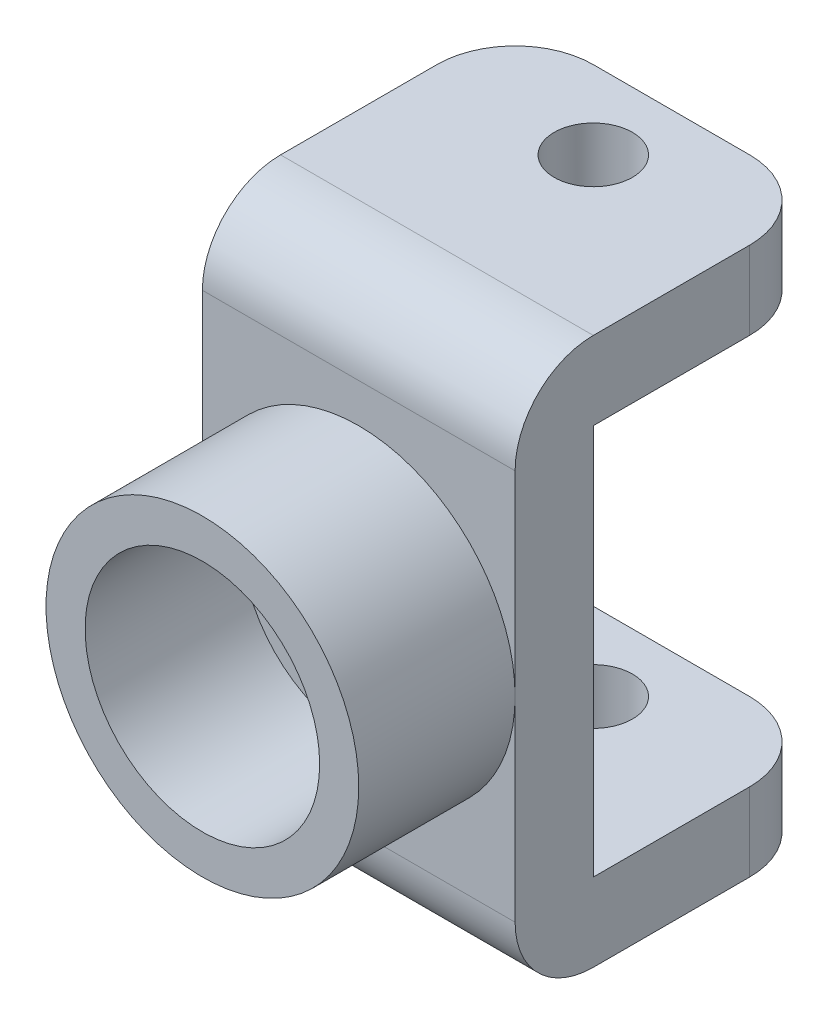
ISO-10303-21;
HEADER;
FILE_DESCRIPTION(('STEP AP214'),'2;1');
FILE_NAME('part.step','',(''),(''),'','','');
FILE_SCHEMA(('AUTOMOTIVE_DESIGN { 1 0 10303 214 1 1 1 1 }'));
ENDSEC;
DATA;
#1=APPLICATION_CONTEXT('core data for automotive mechanical design processes');
#2=APPLICATION_PROTOCOL_DEFINITION('international standard','automotive_design',2000,#1);
#3=PRODUCT_CONTEXT('',#1,'mechanical');
#4=PRODUCT('Part','Part','',(#3));
#5=PRODUCT_RELATED_PRODUCT_CATEGORY('part','',(#4));
#6=PRODUCT_DEFINITION_FORMATION('','',#4);
#7=PRODUCT_DEFINITION_CONTEXT('part definition',#1,'design');
#8=PRODUCT_DEFINITION('design','',#6,#7);
#9=PRODUCT_DEFINITION_SHAPE('','',#8);
#10=(LENGTH_UNIT() NAMED_UNIT(*) SI_UNIT(.MILLI.,.METRE.));
#11=(NAMED_UNIT(*) PLANE_ANGLE_UNIT() SI_UNIT($,.RADIAN.));
#12=(NAMED_UNIT(*) SI_UNIT($,.STERADIAN.) SOLID_ANGLE_UNIT());
#13=UNCERTAINTY_MEASURE_WITH_UNIT(LENGTH_MEASURE(1.E-05),#10,'distance_accuracy_value','');
#14=(GEOMETRIC_REPRESENTATION_CONTEXT(3) GLOBAL_UNCERTAINTY_ASSIGNED_CONTEXT((#13)) GLOBAL_UNIT_ASSIGNED_CONTEXT((#10,
#11,#12)) REPRESENTATION_CONTEXT('',''));
#15=CARTESIAN_POINT('',(0.,0.,0.));
#16=DIRECTION('',(0.,0.,1.));
#17=DIRECTION('',(1.,0.,0.));
#18=AXIS2_PLACEMENT_3D('',#15,#16,#17);
#19=CARTESIAN_POINT('',(0.,0.,10.));
#20=DIRECTION('',(0.,0.,1.));
#21=DIRECTION('',(1.,0.,0.));
#22=AXIS2_PLACEMENT_3D('',#19,#20,#21);
#23=PLANE('',#22);
#24=DIRECTION('',(0.,1.,0.));
#25=VECTOR('',#24,1.);
#26=CARTESIAN_POINT('',(20.,25.,10.));
#27=LINE('',#26,#25);
#28=CARTESIAN_POINT('',(20.,-25.,10.));
#29=VERTEX_POINT('',#28);
#30=CARTESIAN_POINT('',(20.,0.,10.));
#31=VERTEX_POINT('',#30);
#32=EDGE_CURVE('E159',#29,#31,#27,.T.);
#33=ORIENTED_EDGE('',*,*,#32,.T.);
#34=CARTESIAN_POINT('',(0.,0.,10.));
#35=DIRECTION('',(0.,0.,1.));
#36=DIRECTION('',(1.,0.,0.));
#37=AXIS2_PLACEMENT_3D('',#34,#35,#36);
#38=CIRCLE('',#37,20.);
#39=CARTESIAN_POINT('',(-20.,0.,10.));
#40=VERTEX_POINT('',#39);
#41=EDGE_CURVE('E11',#31,#40,#38,.F.);
#42=ORIENTED_EDGE('',*,*,#41,.T.);
#43=DIRECTION('',(0.,-1.,0.));
#44=VECTOR('',#43,1.);
#45=CARTESIAN_POINT('',(-20.,25.,10.));
#46=LINE('',#45,#44);
#47=CARTESIAN_POINT('',(-20.,-25.,10.));
#48=VERTEX_POINT('',#47);
#49=EDGE_CURVE('E156',#40,#48,#46,.T.);
#50=ORIENTED_EDGE('',*,*,#49,.T.);
#51=DIRECTION('',(-1.,0.,0.));
#52=VECTOR('',#51,1.);
#53=CARTESIAN_POINT('',(20.,-25.,10.));
#54=LINE('',#53,#52);
#55=EDGE_CURVE('E218',#48,#29,#54,.F.);
#56=ORIENTED_EDGE('',*,*,#55,.T.);
#57=EDGE_LOOP('',(#33,#42,#50,#56));
#58=FACE_BOUND('',#57,.T.);
#59=ADVANCED_FACE('F39',(#58),#23,.T.);
#60=CARTESIAN_POINT('',(20.,25.,10.));
#61=DIRECTION('',(-1.,0.,0.));
#62=DIRECTION('',(0.,-1.,0.));
#63=AXIS2_PLACEMENT_3D('',#60,#61,#62);
#64=PLANE('',#63);
#65=ORIENTED_EDGE('',*,*,#32,.F.);
#66=CARTESIAN_POINT('',(20.,-25.,0.));
#67=DIRECTION('',(-1.,0.,0.));
#68=DIRECTION('',(0.,-1.,0.));
#69=AXIS2_PLACEMENT_3D('',#66,#67,#68);
#70=CIRCLE('',#69,10.);
#71=CARTESIAN_POINT('',(20.,-35.,0.));
#72=VERTEX_POINT('',#71);
#73=EDGE_CURVE('E233',#29,#72,#70,.F.);
#74=ORIENTED_EDGE('',*,*,#73,.T.);
#75=DIRECTION('',(0.,0.,-1.));
#76=VECTOR('',#75,1.);
#77=CARTESIAN_POINT('',(20.,-35.,10.));
#78=LINE('',#77,#76);
#79=CARTESIAN_POINT('',(20.,-35.,-20.));
#80=VERTEX_POINT('',#79);
#81=EDGE_CURVE('E377',#72,#80,#78,.T.);
#82=ORIENTED_EDGE('',*,*,#81,.T.);
#83=DIRECTION('',(0.,1.,0.));
#84=VECTOR('',#83,1.);
#85=CARTESIAN_POINT('',(20.,25.,-20.));
#86=LINE('',#85,#84);
#87=CARTESIAN_POINT('',(20.,-25.,-20.));
#88=VERTEX_POINT('',#87);
#89=EDGE_CURVE('E229',#80,#88,#86,.T.);
#90=ORIENTED_EDGE('',*,*,#89,.T.);
#91=DIRECTION('',(0.,0.,1.));
#92=VECTOR('',#91,1.);
#93=CARTESIAN_POINT('',(20.,-25.,10.));
#94=LINE('',#93,#92);
#95=CARTESIAN_POINT('',(20.,-25.,0.));
#96=VERTEX_POINT('',#95);
#97=EDGE_CURVE('E371',#88,#96,#94,.T.);
#98=ORIENTED_EDGE('',*,*,#97,.T.);
#99=DIRECTION('',(0.,1.,0.));
#100=VECTOR('',#99,1.);
#101=CARTESIAN_POINT('',(20.,25.,0.));
#102=LINE('',#101,#100);
#103=CARTESIAN_POINT('',(20.,25.,0.));
#104=VERTEX_POINT('',#103);
#105=EDGE_CURVE('E181',#96,#104,#102,.T.);
#106=ORIENTED_EDGE('',*,*,#105,.T.);
#107=DIRECTION('',(0.,0.,-1.));
#108=VECTOR('',#107,1.);
#109=CARTESIAN_POINT('',(20.,25.,10.));
#110=LINE('',#109,#108);
#111=CARTESIAN_POINT('',(20.,25.,-20.));
#112=VERTEX_POINT('',#111);
#113=EDGE_CURVE('E338',#104,#112,#110,.T.);
#114=ORIENTED_EDGE('',*,*,#113,.T.);
#115=DIRECTION('',(0.,1.,0.));
#116=VECTOR('',#115,1.);
#117=CARTESIAN_POINT('',(20.,25.,-20.));
#118=LINE('',#117,#116);
#119=CARTESIAN_POINT('',(20.,35.,-20.));
#120=VERTEX_POINT('',#119);
#121=EDGE_CURVE('E221',#112,#120,#118,.T.);
#122=ORIENTED_EDGE('',*,*,#121,.T.);
#123=DIRECTION('',(0.,0.,1.));
#124=VECTOR('',#123,1.);
#125=CARTESIAN_POINT('',(20.,35.,10.));
#126=LINE('',#125,#124);
#127=CARTESIAN_POINT('',(20.,35.,0.));
#128=VERTEX_POINT('',#127);
#129=EDGE_CURVE('E332',#120,#128,#126,.T.);
#130=ORIENTED_EDGE('',*,*,#129,.T.);
#131=CARTESIAN_POINT('',(20.,25.,0.));
#132=DIRECTION('',(-1.,0.,0.));
#133=DIRECTION('',(0.,-1.,0.));
#134=AXIS2_PLACEMENT_3D('',#131,#132,#133);
#135=CIRCLE('',#134,10.);
#136=CARTESIAN_POINT('',(20.,25.,10.));
#137=VERTEX_POINT('',#136);
#138=EDGE_CURVE('E225',#128,#137,#135,.F.);
#139=ORIENTED_EDGE('',*,*,#138,.T.);
#140=EDGE_CURVE('E197',#31,#137,#27,.T.);
#141=ORIENTED_EDGE('',*,*,#140,.F.);
#142=EDGE_LOOP('',(#65,#74,#82,#90,#98,#106,#114,#122,#130,#139,#141));
#143=FACE_BOUND('',#142,.T.);
#144=ADVANCED_FACE('F293',(#143),#64,.F.);
#145=CARTESIAN_POINT('',(-20.,25.,10.));
#146=DIRECTION('',(1.,0.,0.));
#147=DIRECTION('',(0.,1.,0.));
#148=AXIS2_PLACEMENT_3D('',#145,#146,#147);
#149=PLANE('',#148);
#150=DIRECTION('',(0.,0.,-1.));
#151=VECTOR('',#150,1.);
#152=CARTESIAN_POINT('',(-20.,-35.,10.));
#153=LINE('',#152,#151);
#154=CARTESIAN_POINT('',(-20.,-35.,0.));
#155=VERTEX_POINT('',#154);
#156=CARTESIAN_POINT('',(-20.,-35.,-20.));
#157=VERTEX_POINT('',#156);
#158=EDGE_CURVE('E386',#155,#157,#153,.T.);
#159=ORIENTED_EDGE('',*,*,#158,.F.);
#160=CARTESIAN_POINT('',(-20.,-25.,0.));
#161=DIRECTION('',(1.,0.,0.));
#162=DIRECTION('',(0.,1.,0.));
#163=AXIS2_PLACEMENT_3D('',#160,#161,#162);
#164=CIRCLE('',#163,10.);
#165=EDGE_CURVE('E165',#155,#48,#164,.F.);
#166=ORIENTED_EDGE('',*,*,#165,.T.);
#167=ORIENTED_EDGE('',*,*,#49,.F.);
#168=CARTESIAN_POINT('',(-20.,25.,10.));
#169=VERTEX_POINT('',#168);
#170=EDGE_CURVE('E164',#169,#40,#46,.T.);
#171=ORIENTED_EDGE('',*,*,#170,.F.);
#172=CARTESIAN_POINT('',(-20.,25.,0.));
#173=DIRECTION('',(1.,0.,0.));
#174=DIRECTION('',(0.,1.,0.));
#175=AXIS2_PLACEMENT_3D('',#172,#173,#174);
#176=CIRCLE('',#175,10.);
#177=CARTESIAN_POINT('',(-20.,35.,0.));
#178=VERTEX_POINT('',#177);
#179=EDGE_CURVE('E205',#169,#178,#176,.F.);
#180=ORIENTED_EDGE('',*,*,#179,.T.);
#181=DIRECTION('',(0.,0.,1.));
#182=VECTOR('',#181,1.);
#183=CARTESIAN_POINT('',(-20.,35.,10.));
#184=LINE('',#183,#182);
#185=CARTESIAN_POINT('',(-20.,35.,-20.));
#186=VERTEX_POINT('',#185);
#187=EDGE_CURVE('E344',#186,#178,#184,.T.);
#188=ORIENTED_EDGE('',*,*,#187,.F.);
#189=DIRECTION('',(0.,1.,0.));
#190=VECTOR('',#189,1.);
#191=CARTESIAN_POINT('',(-20.,25.,-20.));
#192=LINE('',#191,#190);
#193=CARTESIAN_POINT('',(-20.,25.,-20.));
#194=VERTEX_POINT('',#193);
#195=EDGE_CURVE('E208',#186,#194,#192,.F.);
#196=ORIENTED_EDGE('',*,*,#195,.T.);
#197=DIRECTION('',(0.,0.,-1.));
#198=VECTOR('',#197,1.);
#199=CARTESIAN_POINT('',(-20.,25.,10.));
#200=LINE('',#199,#198);
#201=CARTESIAN_POINT('',(-20.,25.,0.));
#202=VERTEX_POINT('',#201);
#203=EDGE_CURVE('E348',#202,#194,#200,.T.);
#204=ORIENTED_EDGE('',*,*,#203,.F.);
#205=DIRECTION('',(0.,-1.,0.));
#206=VECTOR('',#205,1.);
#207=CARTESIAN_POINT('',(-20.,25.,0.));
#208=LINE('',#207,#206);
#209=CARTESIAN_POINT('',(-20.,-25.,0.));
#210=VERTEX_POINT('',#209);
#211=EDGE_CURVE('E190',#202,#210,#208,.T.);
#212=ORIENTED_EDGE('',*,*,#211,.T.);
#213=DIRECTION('',(0.,0.,1.));
#214=VECTOR('',#213,1.);
#215=CARTESIAN_POINT('',(-20.,-25.,10.));
#216=LINE('',#215,#214);
#217=CARTESIAN_POINT('',(-20.,-25.,-20.));
#218=VERTEX_POINT('',#217);
#219=EDGE_CURVE('E383',#218,#210,#216,.T.);
#220=ORIENTED_EDGE('',*,*,#219,.F.);
#221=DIRECTION('',(0.,1.,0.));
#222=VECTOR('',#221,1.);
#223=CARTESIAN_POINT('',(-20.,25.,-20.));
#224=LINE('',#223,#222);
#225=EDGE_CURVE('E211',#218,#157,#224,.F.);
#226=ORIENTED_EDGE('',*,*,#225,.T.);
#227=EDGE_LOOP('',(#159,#166,#167,#171,#180,#188,#196,#204,#212,#220,#226));
#228=FACE_BOUND('',#227,.T.);
#229=ADVANCED_FACE('F163',(#228),#149,.F.);
#230=ORIENTED_EDGE('',*,*,#170,.T.);
#231=CARTESIAN_POINT('',(0.,0.,10.));
#232=DIRECTION('',(0.,0.,1.));
#233=DIRECTION('',(1.,0.,0.));
#234=AXIS2_PLACEMENT_3D('',#231,#232,#233);
#235=CIRCLE('',#234,20.);
#236=EDGE_CURVE('E144',#31,#40,#235,.T.);
#237=ORIENTED_EDGE('',*,*,#236,.F.);
#238=ORIENTED_EDGE('',*,*,#140,.T.);
#239=DIRECTION('',(-1.,0.,0.));
#240=VECTOR('',#239,1.);
#241=CARTESIAN_POINT('',(-20.,25.,10.));
#242=LINE('',#241,#240);
#243=EDGE_CURVE('E172',#137,#169,#242,.T.);
#244=ORIENTED_EDGE('',*,*,#243,.T.);
#245=EDGE_LOOP('',(#230,#237,#238,#244));
#246=FACE_BOUND('',#245,.T.);
#247=ADVANCED_FACE('F170',(#246),#23,.T.);
#248=CARTESIAN_POINT('',(0.,0.,0.));
#249=DIRECTION('',(0.,0.,1.));
#250=DIRECTION('',(1.,0.,0.));
#251=AXIS2_PLACEMENT_3D('',#248,#249,#250);
#252=PLANE('',#251);
#253=ORIENTED_EDGE('',*,*,#105,.F.);
#254=DIRECTION('',(1.,0.,0.));
#255=VECTOR('',#254,1.);
#256=CARTESIAN_POINT('',(-20.,-25.,0.));
#257=LINE('',#256,#255);
#258=EDGE_CURVE('E194',#210,#96,#257,.T.);
#259=ORIENTED_EDGE('',*,*,#258,.F.);
#260=ORIENTED_EDGE('',*,*,#211,.F.);
#261=DIRECTION('',(-1.,0.,0.));
#262=VECTOR('',#261,1.);
#263=CARTESIAN_POINT('',(-20.,25.,0.));
#264=LINE('',#263,#262);
#265=EDGE_CURVE('E185',#104,#202,#264,.T.);
#266=ORIENTED_EDGE('',*,*,#265,.F.);
#267=EDGE_LOOP('',(#253,#259,#260,#266));
#268=FACE_BOUND('',#267,.T.);
#269=ADVANCED_FACE('F291',(#268),#252,.F.);
#270=CARTESIAN_POINT('',(20.,25.,10.));
#271=DIRECTION('',(0.,1.,0.));
#272=DIRECTION('',(0.,0.,1.));
#273=AXIS2_PLACEMENT_3D('',#270,#271,#272);
#274=PLANE('',#273);
#275=CARTESIAN_POINT('',(0.,25.,-20.));
#276=DIRECTION('',(0.,1.,0.));
#277=DIRECTION('',(0.,0.,1.));
#278=AXIS2_PLACEMENT_3D('',#275,#276,#277);
#279=CIRCLE('',#278,5.);
#280=CARTESIAN_POINT('',(0.,25.,-15.));
#281=VERTEX_POINT('',#280);
#282=EDGE_CURVE('E433',#281,#281,#279,.T.);
#283=ORIENTED_EDGE('',*,*,#282,.T.);
#284=EDGE_LOOP('',(#283));
#285=FACE_BOUND('',#284,.T.);
#286=ORIENTED_EDGE('',*,*,#203,.T.);
#287=CARTESIAN_POINT('',(-10.,25.,-20.));
#288=DIRECTION('',(0.,1.,0.));
#289=DIRECTION('',(0.,0.,1.));
#290=AXIS2_PLACEMENT_3D('',#287,#288,#289);
#291=CIRCLE('',#290,10.);
#292=CARTESIAN_POINT('',(-10.,25.,-30.));
#293=VERTEX_POINT('',#292);
#294=EDGE_CURVE('E60',#194,#293,#291,.F.);
#295=ORIENTED_EDGE('',*,*,#294,.T.);
#296=DIRECTION('',(-1.,0.,0.));
#297=VECTOR('',#296,1.);
#298=CARTESIAN_POINT('',(20.,25.,-30.));
#299=LINE('',#298,#297);
#300=CARTESIAN_POINT('',(9.99999999999999,25.,-30.));
#301=VERTEX_POINT('',#300);
#302=EDGE_CURVE('E186',#301,#293,#299,.T.);
#303=ORIENTED_EDGE('',*,*,#302,.F.);
#304=CARTESIAN_POINT('',(9.99999999999999,25.,-20.));
#305=DIRECTION('',(0.,1.,0.));
#306=DIRECTION('',(0.,0.,1.));
#307=AXIS2_PLACEMENT_3D('',#304,#305,#306);
#308=CIRCLE('',#307,10.);
#309=EDGE_CURVE('E265',#301,#112,#308,.F.);
#310=ORIENTED_EDGE('',*,*,#309,.T.);
#311=ORIENTED_EDGE('',*,*,#113,.F.);
#312=ORIENTED_EDGE('',*,*,#265,.T.);
#313=EDGE_LOOP('',(#286,#295,#303,#310,#311,#312));
#314=FACE_BOUND('',#313,.T.);
#315=ADVANCED_FACE('F365',(#285,#314),#274,.F.);
#316=CARTESIAN_POINT('',(20.,25.,-30.));
#317=DIRECTION('',(0.,0.,1.));
#318=DIRECTION('',(1.,0.,0.));
#319=AXIS2_PLACEMENT_3D('',#316,#317,#318);
#320=PLANE('',#319);
#321=ORIENTED_EDGE('',*,*,#302,.T.);
#322=DIRECTION('',(0.,1.,0.));
#323=VECTOR('',#322,1.);
#324=CARTESIAN_POINT('',(-10.,25.,-30.));
#325=LINE('',#324,#323);
#326=CARTESIAN_POINT('',(-10.,35.,-30.));
#327=VERTEX_POINT('',#326);
#328=EDGE_CURVE('E252',#293,#327,#325,.T.);
#329=ORIENTED_EDGE('',*,*,#328,.T.);
#330=DIRECTION('',(-1.,0.,0.));
#331=VECTOR('',#330,1.);
#332=CARTESIAN_POINT('',(20.,35.,-30.));
#333=LINE('',#332,#331);
#334=CARTESIAN_POINT('',(9.99999999999999,35.,-30.));
#335=VERTEX_POINT('',#334);
#336=EDGE_CURVE('E337',#335,#327,#333,.T.);
#337=ORIENTED_EDGE('',*,*,#336,.F.);
#338=DIRECTION('',(0.,1.,0.));
#339=VECTOR('',#338,1.);
#340=CARTESIAN_POINT('',(9.99999999999999,25.,-30.));
#341=LINE('',#340,#339);
#342=EDGE_CURVE('E249',#335,#301,#341,.F.);
#343=ORIENTED_EDGE('',*,*,#342,.T.);
#344=EDGE_LOOP('',(#321,#329,#337,#343));
#345=FACE_BOUND('',#344,.T.);
#346=ADVANCED_FACE('F357',(#345),#320,.F.);
#347=CARTESIAN_POINT('',(20.,35.,10.));
#348=DIRECTION('',(0.,-1.,0.));
#349=DIRECTION('',(0.,0.,-1.));
#350=AXIS2_PLACEMENT_3D('',#347,#348,#349);
#351=PLANE('',#350);
#352=CARTESIAN_POINT('',(0.,35.,-20.));
#353=DIRECTION('',(0.,-1.,0.));
#354=DIRECTION('',(0.,0.,-1.));
#355=AXIS2_PLACEMENT_3D('',#352,#353,#354);
#356=CIRCLE('',#355,5.);
#357=CARTESIAN_POINT('',(0.,35.,-25.));
#358=VERTEX_POINT('',#357);
#359=EDGE_CURVE('E443',#358,#358,#356,.T.);
#360=ORIENTED_EDGE('',*,*,#359,.T.);
#361=EDGE_LOOP('',(#360));
#362=FACE_BOUND('',#361,.T.);
#363=ORIENTED_EDGE('',*,*,#336,.T.);
#364=CARTESIAN_POINT('',(-10.,35.,-20.));
#365=DIRECTION('',(0.,-1.,0.));
#366=DIRECTION('',(0.,0.,-1.));
#367=AXIS2_PLACEMENT_3D('',#364,#365,#366);
#368=CIRCLE('',#367,10.);
#369=EDGE_CURVE('E262',#327,#186,#368,.F.);
#370=ORIENTED_EDGE('',*,*,#369,.T.);
#371=ORIENTED_EDGE('',*,*,#187,.T.);
#372=DIRECTION('',(-1.,0.,0.));
#373=VECTOR('',#372,1.);
#374=CARTESIAN_POINT('',(20.,35.,0.));
#375=LINE('',#374,#373);
#376=EDGE_CURVE('E259',#178,#128,#375,.F.);
#377=ORIENTED_EDGE('',*,*,#376,.T.);
#378=ORIENTED_EDGE('',*,*,#129,.F.);
#379=CARTESIAN_POINT('',(9.99999999999999,35.,-20.));
#380=DIRECTION('',(0.,-1.,0.));
#381=DIRECTION('',(0.,0.,-1.));
#382=AXIS2_PLACEMENT_3D('',#379,#380,#381);
#383=CIRCLE('',#382,10.);
#384=EDGE_CURVE('E256',#120,#335,#383,.F.);
#385=ORIENTED_EDGE('',*,*,#384,.T.);
#386=EDGE_LOOP('',(#363,#370,#371,#377,#378,#385));
#387=FACE_BOUND('',#386,.T.);
#388=ADVANCED_FACE('F363',(#362,#387),#351,.F.);
#389=CARTESIAN_POINT('',(20.,-25.,10.));
#390=DIRECTION('',(0.,-1.,0.));
#391=DIRECTION('',(0.,0.,-1.));
#392=AXIS2_PLACEMENT_3D('',#389,#390,#391);
#393=PLANE('',#392);
#394=CARTESIAN_POINT('',(0.,-25.,-20.));
#395=DIRECTION('',(0.,-1.,0.));
#396=DIRECTION('',(0.,0.,-1.));
#397=AXIS2_PLACEMENT_3D('',#394,#395,#396);
#398=CIRCLE('',#397,5.);
#399=CARTESIAN_POINT('',(0.,-25.,-25.));
#400=VERTEX_POINT('',#399);
#401=EDGE_CURVE('E436',#400,#400,#398,.T.);
#402=ORIENTED_EDGE('',*,*,#401,.T.);
#403=EDGE_LOOP('',(#402));
#404=FACE_BOUND('',#403,.T.);
#405=ORIENTED_EDGE('',*,*,#97,.F.);
#406=CARTESIAN_POINT('',(10.,-25.,-20.));
#407=DIRECTION('',(0.,-1.,0.));
#408=DIRECTION('',(0.,0.,-1.));
#409=AXIS2_PLACEMENT_3D('',#406,#407,#408);
#410=CIRCLE('',#409,10.);
#411=CARTESIAN_POINT('',(10.,-25.,-30.));
#412=VERTEX_POINT('',#411);
#413=EDGE_CURVE('E239',#88,#412,#410,.F.);
#414=ORIENTED_EDGE('',*,*,#413,.T.);
#415=DIRECTION('',(-1.,0.,0.));
#416=VECTOR('',#415,1.);
#417=CARTESIAN_POINT('',(20.,-25.,-30.));
#418=LINE('',#417,#416);
#419=CARTESIAN_POINT('',(-10.,-25.,-30.));
#420=VERTEX_POINT('',#419);
#421=EDGE_CURVE('E376',#412,#420,#418,.T.);
#422=ORIENTED_EDGE('',*,*,#421,.T.);
#423=CARTESIAN_POINT('',(-10.,-25.,-20.));
#424=DIRECTION('',(0.,-1.,0.));
#425=DIRECTION('',(0.,0.,-1.));
#426=AXIS2_PLACEMENT_3D('',#423,#424,#425);
#427=CIRCLE('',#426,10.);
#428=EDGE_CURVE('E236',#420,#218,#427,.F.);
#429=ORIENTED_EDGE('',*,*,#428,.T.);
#430=ORIENTED_EDGE('',*,*,#219,.T.);
#431=ORIENTED_EDGE('',*,*,#258,.T.);
#432=EDGE_LOOP('',(#405,#414,#422,#429,#430,#431));
#433=FACE_BOUND('',#432,.T.);
#434=ADVANCED_FACE('F403',(#404,#433),#393,.F.);
#435=CARTESIAN_POINT('',(20.,-35.,10.));
#436=DIRECTION('',(0.,1.,0.));
#437=DIRECTION('',(0.,0.,1.));
#438=AXIS2_PLACEMENT_3D('',#435,#436,#437);
#439=PLANE('',#438);
#440=CARTESIAN_POINT('',(0.,-35.,-20.));
#441=DIRECTION('',(0.,-1.,0.));
#442=DIRECTION('',(0.,0.,-1.));
#443=AXIS2_PLACEMENT_3D('',#440,#441,#442);
#444=CIRCLE('',#443,5.);
#445=CARTESIAN_POINT('',(0.,-35.,-25.));
#446=VERTEX_POINT('',#445);
#447=EDGE_CURVE('E466',#446,#446,#444,.T.);
#448=ORIENTED_EDGE('',*,*,#447,.F.);
#449=EDGE_LOOP('',(#448));
#450=FACE_BOUND('',#449,.T.);
#451=ORIENTED_EDGE('',*,*,#81,.F.);
#452=DIRECTION('',(-1.,0.,0.));
#453=VECTOR('',#452,1.);
#454=CARTESIAN_POINT('',(-20.,-35.,0.));
#455=LINE('',#454,#453);
#456=EDGE_CURVE('E201',#72,#155,#455,.T.);
#457=ORIENTED_EDGE('',*,*,#456,.T.);
#458=ORIENTED_EDGE('',*,*,#158,.T.);
#459=CARTESIAN_POINT('',(-10.,-35.,-20.));
#460=DIRECTION('',(0.,1.,0.));
#461=DIRECTION('',(0.,0.,1.));
#462=AXIS2_PLACEMENT_3D('',#459,#460,#461);
#463=CIRCLE('',#462,10.);
#464=CARTESIAN_POINT('',(-10.,-35.,-30.));
#465=VERTEX_POINT('',#464);
#466=EDGE_CURVE('E174',#157,#465,#463,.F.);
#467=ORIENTED_EDGE('',*,*,#466,.T.);
#468=DIRECTION('',(-1.,0.,0.));
#469=VECTOR('',#468,1.);
#470=CARTESIAN_POINT('',(20.,-35.,-30.));
#471=LINE('',#470,#469);
#472=CARTESIAN_POINT('',(10.,-35.,-30.));
#473=VERTEX_POINT('',#472);
#474=EDGE_CURVE('E351',#473,#465,#471,.T.);
#475=ORIENTED_EDGE('',*,*,#474,.F.);
#476=CARTESIAN_POINT('',(10.,-35.,-20.));
#477=DIRECTION('',(0.,1.,0.));
#478=DIRECTION('',(0.,0.,1.));
#479=AXIS2_PLACEMENT_3D('',#476,#477,#478);
#480=CIRCLE('',#479,10.);
#481=EDGE_CURVE('E176',#473,#80,#480,.F.);
#482=ORIENTED_EDGE('',*,*,#481,.T.);
#483=EDGE_LOOP('',(#451,#457,#458,#467,#475,#482));
#484=FACE_BOUND('',#483,.T.);
#485=ADVANCED_FACE('F405',(#450,#484),#439,.F.);
#486=CARTESIAN_POINT('',(20.,-25.,-30.));
#487=DIRECTION('',(0.,0.,1.));
#488=DIRECTION('',(1.,0.,0.));
#489=AXIS2_PLACEMENT_3D('',#486,#487,#488);
#490=PLANE('',#489);
#491=ORIENTED_EDGE('',*,*,#421,.F.);
#492=DIRECTION('',(0.,1.,0.));
#493=VECTOR('',#492,1.);
#494=CARTESIAN_POINT('',(10.,-25.,-30.));
#495=LINE('',#494,#493);
#496=EDGE_CURVE('E246',#412,#473,#495,.F.);
#497=ORIENTED_EDGE('',*,*,#496,.T.);
#498=ORIENTED_EDGE('',*,*,#474,.T.);
#499=DIRECTION('',(0.,1.,0.));
#500=VECTOR('',#499,1.);
#501=CARTESIAN_POINT('',(-10.,-25.,-30.));
#502=LINE('',#501,#500);
#503=EDGE_CURVE('E242',#465,#420,#502,.T.);
#504=ORIENTED_EDGE('',*,*,#503,.T.);
#505=EDGE_LOOP('',(#491,#497,#498,#504));
#506=FACE_BOUND('',#505,.T.);
#507=ADVANCED_FACE('F308',(#506),#490,.F.);
#508=CARTESIAN_POINT('',(20.,-25.,0.));
#509=DIRECTION('',(1.,0.,0.));
#510=DIRECTION('',(0.,0.,-1.));
#511=AXIS2_PLACEMENT_3D('',#508,#509,#510);
#512=CYLINDRICAL_SURFACE('',#511,10.);
#513=ORIENTED_EDGE('',*,*,#73,.F.);
#514=ORIENTED_EDGE('',*,*,#55,.F.);
#515=ORIENTED_EDGE('',*,*,#165,.F.);
#516=ORIENTED_EDGE('',*,*,#456,.F.);
#517=EDGE_LOOP('',(#513,#514,#515,#516));
#518=FACE_BOUND('',#517,.T.);
#519=ADVANCED_FACE('F304',(#518),#512,.T.);
#520=CARTESIAN_POINT('',(9.99999999999999,25.,-20.));
#521=DIRECTION('',(0.,1.,0.));
#522=DIRECTION('',(-1.,0.,0.));
#523=AXIS2_PLACEMENT_3D('',#520,#521,#522);
#524=CYLINDRICAL_SURFACE('',#523,10.);
#525=ORIENTED_EDGE('',*,*,#481,.F.);
#526=ORIENTED_EDGE('',*,*,#496,.F.);
#527=ORIENTED_EDGE('',*,*,#413,.F.);
#528=ORIENTED_EDGE('',*,*,#89,.F.);
#529=EDGE_LOOP('',(#525,#526,#527,#528));
#530=FACE_BOUND('',#529,.T.);
#531=ADVANCED_FACE('F307',(#530),#524,.T.);
#532=CARTESIAN_POINT('',(-10.,-25.,-20.));
#533=DIRECTION('',(0.,1.,0.));
#534=DIRECTION('',(-1.,0.,0.));
#535=AXIS2_PLACEMENT_3D('',#532,#533,#534);
#536=CYLINDRICAL_SURFACE('',#535,10.);
#537=ORIENTED_EDGE('',*,*,#466,.F.);
#538=ORIENTED_EDGE('',*,*,#225,.F.);
#539=ORIENTED_EDGE('',*,*,#428,.F.);
#540=ORIENTED_EDGE('',*,*,#503,.F.);
#541=EDGE_LOOP('',(#537,#538,#539,#540));
#542=FACE_BOUND('',#541,.T.);
#543=ADVANCED_FACE('F312',(#542),#536,.T.);
#544=CARTESIAN_POINT('',(-10.,25.,-20.));
#545=DIRECTION('',(0.,1.,0.));
#546=DIRECTION('',(-1.,0.,0.));
#547=AXIS2_PLACEMENT_3D('',#544,#545,#546);
#548=CYLINDRICAL_SURFACE('',#547,10.);
#549=ORIENTED_EDGE('',*,*,#294,.F.);
#550=ORIENTED_EDGE('',*,*,#195,.F.);
#551=ORIENTED_EDGE('',*,*,#369,.F.);
#552=ORIENTED_EDGE('',*,*,#328,.F.);
#553=EDGE_LOOP('',(#549,#550,#551,#552));
#554=FACE_BOUND('',#553,.T.);
#555=ADVANCED_FACE('F316',(#554),#548,.T.);
#556=CARTESIAN_POINT('',(0.,25.,0.));
#557=DIRECTION('',(1.,0.,0.));
#558=DIRECTION('',(0.,0.,-1.));
#559=AXIS2_PLACEMENT_3D('',#556,#557,#558);
#560=CYLINDRICAL_SURFACE('',#559,10.);
#561=ORIENTED_EDGE('',*,*,#138,.F.);
#562=ORIENTED_EDGE('',*,*,#376,.F.);
#563=ORIENTED_EDGE('',*,*,#179,.F.);
#564=ORIENTED_EDGE('',*,*,#243,.F.);
#565=EDGE_LOOP('',(#561,#562,#563,#564));
#566=FACE_BOUND('',#565,.T.);
#567=ADVANCED_FACE('F319',(#566),#560,.T.);
#568=CARTESIAN_POINT('',(9.99999999999999,25.,-20.));
#569=DIRECTION('',(0.,1.,0.));
#570=DIRECTION('',(-1.,0.,0.));
#571=AXIS2_PLACEMENT_3D('',#568,#569,#570);
#572=CYLINDRICAL_SURFACE('',#571,10.);
#573=ORIENTED_EDGE('',*,*,#309,.F.);
#574=ORIENTED_EDGE('',*,*,#342,.F.);
#575=ORIENTED_EDGE('',*,*,#384,.F.);
#576=ORIENTED_EDGE('',*,*,#121,.F.);
#577=EDGE_LOOP('',(#573,#574,#575,#576));
#578=FACE_BOUND('',#577,.T.);
#579=ADVANCED_FACE('F41',(#578),#572,.T.);
#580=CARTESIAN_POINT('',(0.,0.,30.));
#581=DIRECTION('',(0.,0.,1.));
#582=DIRECTION('',(1.,0.,0.));
#583=AXIS2_PLACEMENT_3D('',#580,#581,#582);
#584=PLANE('',#583);
#585=CARTESIAN_POINT('',(0.,0.,30.));
#586=DIRECTION('',(0.,0.,1.));
#587=DIRECTION('',(1.,0.,0.));
#588=AXIS2_PLACEMENT_3D('',#585,#586,#587);
#589=CIRCLE('',#588,20.);
#590=CARTESIAN_POINT('',(20.,0.,30.));
#591=VERTEX_POINT('',#590);
#592=EDGE_CURVE('E150',#591,#591,#589,.T.);
#593=ORIENTED_EDGE('',*,*,#592,.T.);
#594=EDGE_LOOP('',(#593));
#595=FACE_BOUND('',#594,.T.);
#596=CARTESIAN_POINT('',(0.,0.,30.));
#597=DIRECTION('',(0.,0.,1.));
#598=DIRECTION('',(1.,0.,0.));
#599=AXIS2_PLACEMENT_3D('',#596,#597,#598);
#600=CIRCLE('',#599,15.);
#601=CARTESIAN_POINT('',(15.,0.,30.));
#602=VERTEX_POINT('',#601);
#603=EDGE_CURVE('E151',#602,#602,#600,.T.);
#604=ORIENTED_EDGE('',*,*,#603,.F.);
#605=EDGE_LOOP('',(#604));
#606=FACE_BOUND('',#605,.T.);
#607=ADVANCED_FACE('F326',(#595,#606),#584,.T.);
#608=CARTESIAN_POINT('',(0.,0.,30.));
#609=DIRECTION('',(0.,0.,-1.));
#610=DIRECTION('',(-1.,0.,0.));
#611=AXIS2_PLACEMENT_3D('',#608,#609,#610);
#612=CYLINDRICAL_SURFACE('',#611,20.);
#613=ORIENTED_EDGE('',*,*,#592,.F.);
#614=EDGE_LOOP('',(#613));
#615=FACE_BOUND('',#614,.T.);
#616=ORIENTED_EDGE('',*,*,#236,.T.);
#617=ORIENTED_EDGE('',*,*,#41,.F.);
#618=EDGE_LOOP('',(#616,#617));
#619=FACE_BOUND('',#618,.T.);
#620=ADVANCED_FACE('F145',(#615,#619),#612,.T.);
#621=CARTESIAN_POINT('',(0.,0.,30.));
#622=DIRECTION('',(0.,0.,-1.));
#623=DIRECTION('',(-1.,0.,0.));
#624=AXIS2_PLACEMENT_3D('',#621,#622,#623);
#625=CYLINDRICAL_SURFACE('',#624,15.);
#626=ORIENTED_EDGE('',*,*,#603,.T.);
#627=EDGE_LOOP('',(#626));
#628=FACE_BOUND('',#627,.T.);
#629=CARTESIAN_POINT('',(0.,0.,10.));
#630=DIRECTION('',(0.,0.,1.));
#631=DIRECTION('',(1.,0.,0.));
#632=AXIS2_PLACEMENT_3D('',#629,#630,#631);
#633=CIRCLE('',#632,15.);
#634=CARTESIAN_POINT('',(15.,0.,10.));
#635=VERTEX_POINT('',#634);
#636=EDGE_CURVE('E48',#635,#635,#633,.F.);
#637=ORIENTED_EDGE('',*,*,#636,.T.);
#638=EDGE_LOOP('',(#637));
#639=FACE_BOUND('',#638,.T.);
#640=ADVANCED_FACE('F273',(#628,#639),#625,.F.);
#641=ORIENTED_EDGE('',*,*,#636,.F.);
#642=EDGE_LOOP('',(#641));
#643=FACE_BOUND('',#642,.T.);
#644=ADVANCED_FACE('F275',(#643),#23,.T.);
#645=CARTESIAN_POINT('',(0.,35.,-20.));
#646=DIRECTION('',(0.,-1.,0.));
#647=DIRECTION('',(0.,0.,-1.));
#648=AXIS2_PLACEMENT_3D('',#645,#646,#647);
#649=CYLINDRICAL_SURFACE('',#648,5.);
#650=ORIENTED_EDGE('',*,*,#447,.T.);
#651=EDGE_LOOP('',(#650));
#652=FACE_BOUND('',#651,.T.);
#653=ORIENTED_EDGE('',*,*,#401,.F.);
#654=EDGE_LOOP('',(#653));
#655=FACE_BOUND('',#654,.T.);
#656=ADVANCED_FACE('F277',(#652,#655),#649,.F.);
#657=ORIENTED_EDGE('',*,*,#359,.F.);
#658=EDGE_LOOP('',(#657));
#659=FACE_BOUND('',#658,.T.);
#660=ORIENTED_EDGE('',*,*,#282,.F.);
#661=EDGE_LOOP('',(#660));
#662=FACE_BOUND('',#661,.T.);
#663=ADVANCED_FACE('F283',(#659,#662),#649,.F.);
#664=CLOSED_SHELL('',(#59,#144,#229,#247,#269,#315,#346,#388,#434,#485,#507,#519,#531,#543,#555,
#567,#579,#607,#620,#640,#644,#656,#663));
#665=MANIFOLD_SOLID_BREP('B2',#664);
#666=ADVANCED_BREP_SHAPE_REPRESENTATION('',(#18,#665),#14);
#667=SHAPE_DEFINITION_REPRESENTATION(#9,#666);
ENDSEC;
END-ISO-10303-21;
